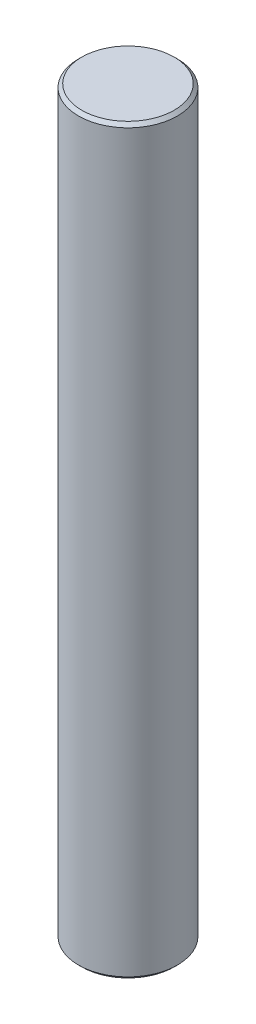
ISO-10303-21;
HEADER;
FILE_DESCRIPTION(('STEP AP214'),'2;1');
FILE_NAME('part.step','',(''),(''),'','','');
FILE_SCHEMA(('AUTOMOTIVE_DESIGN { 1 0 10303 214 1 1 1 1 }'));
ENDSEC;
DATA;
#1=APPLICATION_CONTEXT('core data for automotive mechanical design processes');
#2=APPLICATION_PROTOCOL_DEFINITION('international standard','automotive_design',2000,#1);
#3=PRODUCT_CONTEXT('',#1,'mechanical');
#4=PRODUCT('Part','Part','',(#3));
#5=PRODUCT_RELATED_PRODUCT_CATEGORY('part','',(#4));
#6=PRODUCT_DEFINITION_FORMATION('','',#4);
#7=PRODUCT_DEFINITION_CONTEXT('part definition',#1,'design');
#8=PRODUCT_DEFINITION('design','',#6,#7);
#9=PRODUCT_DEFINITION_SHAPE('','',#8);
#10=(LENGTH_UNIT() NAMED_UNIT(*) SI_UNIT(.MILLI.,.METRE.));
#11=(NAMED_UNIT(*) PLANE_ANGLE_UNIT() SI_UNIT($,.RADIAN.));
#12=(NAMED_UNIT(*) SI_UNIT($,.STERADIAN.) SOLID_ANGLE_UNIT());
#13=UNCERTAINTY_MEASURE_WITH_UNIT(LENGTH_MEASURE(1.E-05),#10,'distance_accuracy_value','');
#14=(GEOMETRIC_REPRESENTATION_CONTEXT(3) GLOBAL_UNCERTAINTY_ASSIGNED_CONTEXT((#13)) GLOBAL_UNIT_ASSIGNED_CONTEXT((#10,
#11,#12)) REPRESENTATION_CONTEXT('',''));
#15=CARTESIAN_POINT('',(0.,0.,0.));
#16=DIRECTION('',(0.,0.,1.));
#17=DIRECTION('',(1.,0.,0.));
#18=AXIS2_PLACEMENT_3D('',#15,#16,#17);
#19=CARTESIAN_POINT('',(0.,-22.5,0.));
#20=DIRECTION('',(0.,1.,0.));
#21=DIRECTION('',(0.,0.,1.));
#22=AXIS2_PLACEMENT_3D('',#19,#20,#21);
#23=PLANE('',#22);
#24=CARTESIAN_POINT('',(0.,-22.5,0.));
#25=DIRECTION('',(0.,1.,0.));
#26=DIRECTION('',(0.,0.,1.));
#27=AXIS2_PLACEMENT_3D('',#24,#25,#26);
#28=CIRCLE('',#27,2.8);
#29=CARTESIAN_POINT('',(0.,-22.5,2.8));
#30=VERTEX_POINT('',#29);
#31=EDGE_CURVE('E37',#30,#30,#28,.F.);
#32=ORIENTED_EDGE('',*,*,#31,.T.);
#33=EDGE_LOOP('',(#32));
#34=FACE_BOUND('',#33,.T.);
#35=ADVANCED_FACE('F30',(#34),#23,.F.);
#36=CARTESIAN_POINT('',(0.,72.7085910652921,0.));
#37=DIRECTION('',(0.,1.,0.));
#38=DIRECTION('',(0.,0.,1.));
#39=AXIS2_PLACEMENT_3D('',#36,#37,#38);
#40=CYLINDRICAL_SURFACE('',#39,3.00000000000001);
#41=CARTESIAN_POINT('',(0.,-22.3,0.));
#42=DIRECTION('',(0.,1.,0.));
#43=DIRECTION('',(0.,0.,1.));
#44=AXIS2_PLACEMENT_3D('',#41,#42,#43);
#45=CIRCLE('',#44,3.00000000000001);
#46=CARTESIAN_POINT('',(0.,-22.3,3.00000000000001));
#47=VERTEX_POINT('',#46);
#48=EDGE_CURVE('E41',#47,#47,#45,.T.);
#49=ORIENTED_EDGE('',*,*,#48,.T.);
#50=EDGE_LOOP('',(#49));
#51=FACE_BOUND('',#50,.T.);
#52=CARTESIAN_POINT('',(0.,22.3,0.));
#53=DIRECTION('',(0.,-1.,0.));
#54=DIRECTION('',(0.,0.,-1.));
#55=AXIS2_PLACEMENT_3D('',#52,#53,#54);
#56=CIRCLE('',#55,3.00000000000001);
#57=CARTESIAN_POINT('',(0.,22.3,-3.00000000000001));
#58=VERTEX_POINT('',#57);
#59=EDGE_CURVE('E45',#58,#58,#56,.T.);
#60=ORIENTED_EDGE('',*,*,#59,.T.);
#61=EDGE_LOOP('',(#60));
#62=FACE_BOUND('',#61,.T.);
#63=ADVANCED_FACE('F51',(#51,#62),#40,.T.);
#64=CARTESIAN_POINT('',(0.,22.5,0.));
#65=DIRECTION('',(0.,-1.,0.));
#66=DIRECTION('',(0.,0.,-1.));
#67=AXIS2_PLACEMENT_3D('',#64,#65,#66);
#68=PLANE('',#67);
#69=CARTESIAN_POINT('',(0.,22.5,0.));
#70=DIRECTION('',(0.,-1.,0.));
#71=DIRECTION('',(0.,0.,-1.));
#72=AXIS2_PLACEMENT_3D('',#69,#70,#71);
#73=CIRCLE('',#72,2.80000000000001);
#74=CARTESIAN_POINT('',(0.,22.5,-2.80000000000001));
#75=VERTEX_POINT('',#74);
#76=EDGE_CURVE('E10',#75,#75,#73,.F.);
#77=ORIENTED_EDGE('',*,*,#76,.T.);
#78=EDGE_LOOP('',(#77));
#79=FACE_BOUND('',#78,.T.);
#80=ADVANCED_FACE('F59',(#79),#68,.F.);
#81=CARTESIAN_POINT('',(0.,-22.3,0.));
#82=DIRECTION('',(0.,1.,0.));
#83=DIRECTION('',(0.,0.,1.));
#84=AXIS2_PLACEMENT_3D('',#81,#82,#83);
#85=CONICAL_SURFACE('',#84,3.00000000000001,0.785398163397474);
#86=ORIENTED_EDGE('',*,*,#31,.F.);
#87=EDGE_LOOP('',(#86));
#88=FACE_BOUND('',#87,.T.);
#89=ORIENTED_EDGE('',*,*,#48,.F.);
#90=EDGE_LOOP('',(#89));
#91=FACE_BOUND('',#90,.T.);
#92=ADVANCED_FACE('F55',(#88,#91),#85,.T.);
#93=CARTESIAN_POINT('',(0.,22.5,0.));
#94=DIRECTION('',(0.,-1.,0.));
#95=DIRECTION('',(0.,0.,-1.));
#96=AXIS2_PLACEMENT_3D('',#93,#94,#95);
#97=CONICAL_SURFACE('',#96,2.80000000000001,0.785398163397448);
#98=ORIENTED_EDGE('',*,*,#59,.F.);
#99=EDGE_LOOP('',(#98));
#100=FACE_BOUND('',#99,.T.);
#101=ORIENTED_EDGE('',*,*,#76,.F.);
#102=EDGE_LOOP('',(#101));
#103=FACE_BOUND('',#102,.T.);
#104=ADVANCED_FACE('F32',(#100,#103),#97,.T.);
#105=CLOSED_SHELL('',(#35,#63,#80,#92,#104));
#106=MANIFOLD_SOLID_BREP('B2',#105);
#107=ADVANCED_BREP_SHAPE_REPRESENTATION('',(#18,#106),#14);
#108=SHAPE_DEFINITION_REPRESENTATION(#9,#107);
ENDSEC;
END-ISO-10303-21;
